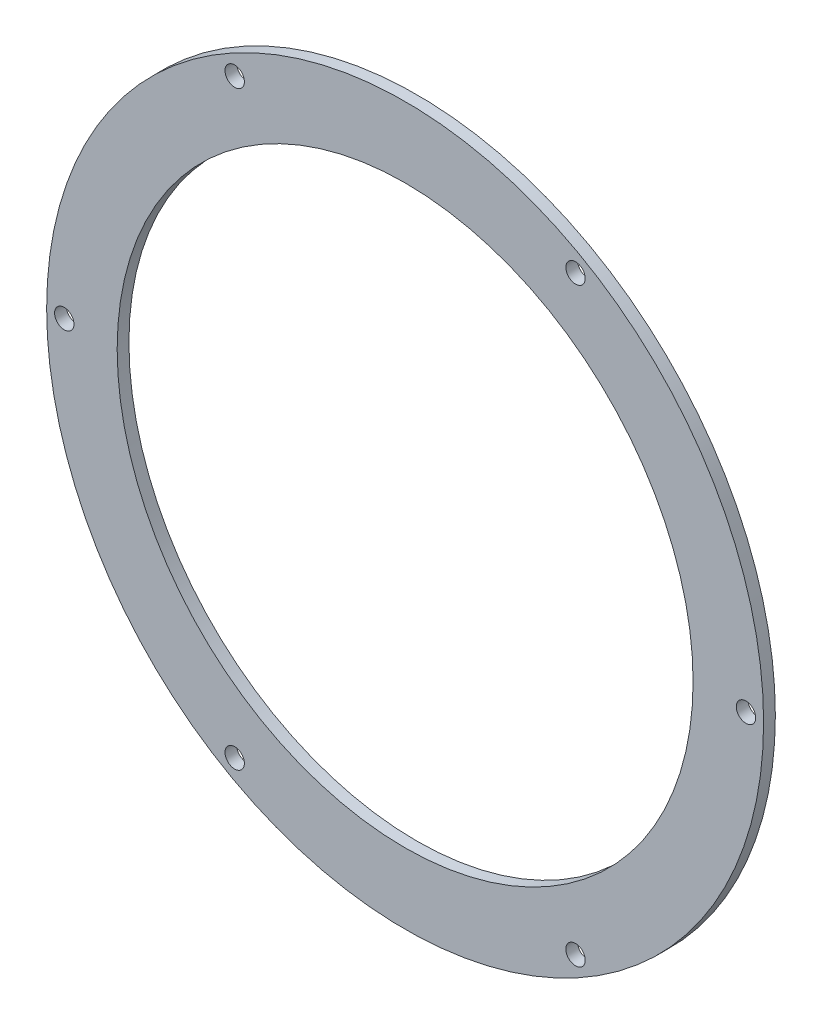
ISO-10303-21;
HEADER;
FILE_DESCRIPTION(('STEP AP214'),'2;1');
FILE_NAME('part.step','',(''),(''),'','','');
FILE_SCHEMA(('AUTOMOTIVE_DESIGN { 1 0 10303 214 1 1 1 1 }'));
ENDSEC;
DATA;
#1=APPLICATION_CONTEXT('core data for automotive mechanical design processes');
#2=APPLICATION_PROTOCOL_DEFINITION('international standard','automotive_design',2000,#1);
#3=PRODUCT_CONTEXT('',#1,'mechanical');
#4=PRODUCT('Part','Part','',(#3));
#5=PRODUCT_RELATED_PRODUCT_CATEGORY('part','',(#4));
#6=PRODUCT_DEFINITION_FORMATION('','',#4);
#7=PRODUCT_DEFINITION_CONTEXT('part definition',#1,'design');
#8=PRODUCT_DEFINITION('design','',#6,#7);
#9=PRODUCT_DEFINITION_SHAPE('','',#8);
#10=(LENGTH_UNIT() NAMED_UNIT(*) SI_UNIT(.MILLI.,.METRE.));
#11=(NAMED_UNIT(*) PLANE_ANGLE_UNIT() SI_UNIT($,.RADIAN.));
#12=(NAMED_UNIT(*) SI_UNIT($,.STERADIAN.) SOLID_ANGLE_UNIT());
#13=UNCERTAINTY_MEASURE_WITH_UNIT(LENGTH_MEASURE(1.E-05),#10,'distance_accuracy_value','');
#14=(GEOMETRIC_REPRESENTATION_CONTEXT(3) GLOBAL_UNCERTAINTY_ASSIGNED_CONTEXT((#13)) GLOBAL_UNIT_ASSIGNED_CONTEXT((#10,
#11,#12)) REPRESENTATION_CONTEXT('',''));
#15=CARTESIAN_POINT('',(0.,0.,0.));
#16=DIRECTION('',(0.,0.,1.));
#17=DIRECTION('',(1.,0.,0.));
#18=AXIS2_PLACEMENT_3D('',#15,#16,#17);
#19=CARTESIAN_POINT('',(0.,0.,17.));
#20=DIRECTION('',(0.,0.,1.));
#21=DIRECTION('',(1.,0.,0.));
#22=AXIS2_PLACEMENT_3D('',#19,#20,#21);
#23=PLANE('',#22);
#24=CARTESIAN_POINT('',(58.,0.,17.));
#25=DIRECTION('',(0.,0.,1.));
#26=DIRECTION('',(1.,0.,0.));
#27=AXIS2_PLACEMENT_3D('',#24,#25,#26);
#28=CIRCLE('',#27,1.65);
#29=CARTESIAN_POINT('',(59.65,0.,17.));
#30=VERTEX_POINT('',#29);
#31=EDGE_CURVE('E95',#30,#30,#28,.T.);
#32=ORIENTED_EDGE('',*,*,#31,.F.);
#33=EDGE_LOOP('',(#32));
#34=FACE_BOUND('',#33,.T.);
#35=CARTESIAN_POINT('',(29.,-50.2294734194974,17.));
#36=DIRECTION('',(0.,0.,1.));
#37=DIRECTION('',(1.,0.,0.));
#38=AXIS2_PLACEMENT_3D('',#35,#36,#37);
#39=CIRCLE('',#38,1.65);
#40=CARTESIAN_POINT('',(30.65,-50.2294734194974,17.));
#41=VERTEX_POINT('',#40);
#42=EDGE_CURVE('E79',#41,#41,#39,.T.);
#43=ORIENTED_EDGE('',*,*,#42,.F.);
#44=EDGE_LOOP('',(#43));
#45=FACE_BOUND('',#44,.T.);
#46=CARTESIAN_POINT('',(-29.,-50.2294734194974,17.));
#47=DIRECTION('',(0.,0.,1.));
#48=DIRECTION('',(1.,0.,0.));
#49=AXIS2_PLACEMENT_3D('',#46,#47,#48);
#50=CIRCLE('',#49,1.65);
#51=CARTESIAN_POINT('',(-27.35,-50.2294734194974,17.));
#52=VERTEX_POINT('',#51);
#53=EDGE_CURVE('E75',#52,#52,#50,.T.);
#54=ORIENTED_EDGE('',*,*,#53,.F.);
#55=EDGE_LOOP('',(#54));
#56=FACE_BOUND('',#55,.T.);
#57=CARTESIAN_POINT('',(-58.,0.,17.));
#58=DIRECTION('',(0.,0.,1.));
#59=DIRECTION('',(1.,0.,0.));
#60=AXIS2_PLACEMENT_3D('',#57,#58,#59);
#61=CIRCLE('',#60,1.65);
#62=CARTESIAN_POINT('',(-56.35,0.,17.));
#63=VERTEX_POINT('',#62);
#64=EDGE_CURVE('E71',#63,#63,#61,.T.);
#65=ORIENTED_EDGE('',*,*,#64,.F.);
#66=EDGE_LOOP('',(#65));
#67=FACE_BOUND('',#66,.T.);
#68=CARTESIAN_POINT('',(-29.,50.2294734194974,17.));
#69=DIRECTION('',(0.,0.,1.));
#70=DIRECTION('',(1.,0.,0.));
#71=AXIS2_PLACEMENT_3D('',#68,#69,#70);
#72=CIRCLE('',#71,1.65);
#73=CARTESIAN_POINT('',(-27.35,50.2294734194974,17.));
#74=VERTEX_POINT('',#73);
#75=EDGE_CURVE('E66',#74,#74,#72,.T.);
#76=ORIENTED_EDGE('',*,*,#75,.F.);
#77=EDGE_LOOP('',(#76));
#78=FACE_BOUND('',#77,.T.);
#79=CARTESIAN_POINT('',(29.,50.2294734194974,17.));
#80=DIRECTION('',(0.,0.,1.));
#81=DIRECTION('',(1.,0.,0.));
#82=AXIS2_PLACEMENT_3D('',#79,#80,#81);
#83=CIRCLE('',#82,1.65);
#84=CARTESIAN_POINT('',(30.65,50.2294734194974,17.));
#85=VERTEX_POINT('',#84);
#86=EDGE_CURVE('E61',#85,#85,#83,.T.);
#87=ORIENTED_EDGE('',*,*,#86,.F.);
#88=EDGE_LOOP('',(#87));
#89=FACE_BOUND('',#88,.T.);
#90=CARTESIAN_POINT('',(0.,0.,17.));
#91=DIRECTION('',(0.,0.,1.));
#92=DIRECTION('',(1.,0.,0.));
#93=AXIS2_PLACEMENT_3D('',#90,#91,#92);
#94=CIRCLE('',#93,61.);
#95=CARTESIAN_POINT('',(61.,0.,17.));
#96=VERTEX_POINT('',#95);
#97=EDGE_CURVE('E10',#96,#96,#94,.T.);
#98=ORIENTED_EDGE('',*,*,#97,.T.);
#99=EDGE_LOOP('',(#98));
#100=FACE_BOUND('',#99,.T.);
#101=CARTESIAN_POINT('',(0.,0.,17.));
#102=DIRECTION('',(0.,0.,1.));
#103=DIRECTION('',(1.,0.,0.));
#104=AXIS2_PLACEMENT_3D('',#101,#102,#103);
#105=CIRCLE('',#104,49.);
#106=CARTESIAN_POINT('',(49.,0.,17.));
#107=VERTEX_POINT('',#106);
#108=EDGE_CURVE('E52',#107,#107,#105,.T.);
#109=ORIENTED_EDGE('',*,*,#108,.F.);
#110=EDGE_LOOP('',(#109));
#111=FACE_BOUND('',#110,.T.);
#112=ADVANCED_FACE('F36',(#34,#45,#56,#67,#78,#89,#100,#111),#23,.T.);
#113=CARTESIAN_POINT('',(0.,0.,15.));
#114=DIRECTION('',(0.,0.,1.));
#115=DIRECTION('',(1.,0.,0.));
#116=AXIS2_PLACEMENT_3D('',#113,#114,#115);
#117=PLANE('',#116);
#118=CARTESIAN_POINT('',(58.,0.,15.));
#119=DIRECTION('',(0.,0.,1.));
#120=DIRECTION('',(1.,0.,0.));
#121=AXIS2_PLACEMENT_3D('',#118,#119,#120);
#122=CIRCLE('',#121,1.65);
#123=CARTESIAN_POINT('',(59.65,0.,15.));
#124=VERTEX_POINT('',#123);
#125=EDGE_CURVE('E40',#124,#124,#122,.T.);
#126=ORIENTED_EDGE('',*,*,#125,.T.);
#127=EDGE_LOOP('',(#126));
#128=FACE_BOUND('',#127,.T.);
#129=CARTESIAN_POINT('',(29.,-50.2294734194974,15.));
#130=DIRECTION('',(0.,0.,1.));
#131=DIRECTION('',(1.,0.,0.));
#132=AXIS2_PLACEMENT_3D('',#129,#130,#131);
#133=CIRCLE('',#132,1.65);
#134=CARTESIAN_POINT('',(30.65,-50.2294734194974,15.));
#135=VERTEX_POINT('',#134);
#136=EDGE_CURVE('E76',#135,#135,#133,.T.);
#137=ORIENTED_EDGE('',*,*,#136,.T.);
#138=EDGE_LOOP('',(#137));
#139=FACE_BOUND('',#138,.T.);
#140=CARTESIAN_POINT('',(-29.,-50.2294734194974,15.));
#141=DIRECTION('',(0.,0.,1.));
#142=DIRECTION('',(1.,0.,0.));
#143=AXIS2_PLACEMENT_3D('',#140,#141,#142);
#144=CIRCLE('',#143,1.65);
#145=CARTESIAN_POINT('',(-27.35,-50.2294734194974,15.));
#146=VERTEX_POINT('',#145);
#147=EDGE_CURVE('E72',#146,#146,#144,.T.);
#148=ORIENTED_EDGE('',*,*,#147,.T.);
#149=EDGE_LOOP('',(#148));
#150=FACE_BOUND('',#149,.T.);
#151=CARTESIAN_POINT('',(-58.,0.,15.));
#152=DIRECTION('',(0.,0.,1.));
#153=DIRECTION('',(1.,0.,0.));
#154=AXIS2_PLACEMENT_3D('',#151,#152,#153);
#155=CIRCLE('',#154,1.65);
#156=CARTESIAN_POINT('',(-56.35,0.,15.));
#157=VERTEX_POINT('',#156);
#158=EDGE_CURVE('E67',#157,#157,#155,.T.);
#159=ORIENTED_EDGE('',*,*,#158,.T.);
#160=EDGE_LOOP('',(#159));
#161=FACE_BOUND('',#160,.T.);
#162=CARTESIAN_POINT('',(-29.,50.2294734194974,15.));
#163=DIRECTION('',(0.,0.,1.));
#164=DIRECTION('',(1.,0.,0.));
#165=AXIS2_PLACEMENT_3D('',#162,#163,#164);
#166=CIRCLE('',#165,1.65);
#167=CARTESIAN_POINT('',(-27.35,50.2294734194974,15.));
#168=VERTEX_POINT('',#167);
#169=EDGE_CURVE('E62',#168,#168,#166,.T.);
#170=ORIENTED_EDGE('',*,*,#169,.T.);
#171=EDGE_LOOP('',(#170));
#172=FACE_BOUND('',#171,.T.);
#173=CARTESIAN_POINT('',(29.,50.2294734194974,15.));
#174=DIRECTION('',(0.,0.,1.));
#175=DIRECTION('',(1.,0.,0.));
#176=AXIS2_PLACEMENT_3D('',#173,#174,#175);
#177=CIRCLE('',#176,1.65);
#178=CARTESIAN_POINT('',(30.65,50.2294734194974,15.));
#179=VERTEX_POINT('',#178);
#180=EDGE_CURVE('E58',#179,#179,#177,.T.);
#181=ORIENTED_EDGE('',*,*,#180,.T.);
#182=EDGE_LOOP('',(#181));
#183=FACE_BOUND('',#182,.T.);
#184=CARTESIAN_POINT('',(0.,0.,15.));
#185=DIRECTION('',(0.,0.,1.));
#186=DIRECTION('',(1.,0.,0.));
#187=AXIS2_PLACEMENT_3D('',#184,#185,#186);
#188=CIRCLE('',#187,61.);
#189=CARTESIAN_POINT('',(61.,0.,15.));
#190=VERTEX_POINT('',#189);
#191=EDGE_CURVE('E45',#190,#190,#188,.T.);
#192=ORIENTED_EDGE('',*,*,#191,.F.);
#193=EDGE_LOOP('',(#192));
#194=FACE_BOUND('',#193,.T.);
#195=CARTESIAN_POINT('',(0.,0.,15.));
#196=DIRECTION('',(0.,0.,1.));
#197=DIRECTION('',(1.,0.,0.));
#198=AXIS2_PLACEMENT_3D('',#195,#196,#197);
#199=CIRCLE('',#198,49.);
#200=CARTESIAN_POINT('',(49.,0.,15.));
#201=VERTEX_POINT('',#200);
#202=EDGE_CURVE('E55',#201,#201,#199,.T.);
#203=ORIENTED_EDGE('',*,*,#202,.T.);
#204=EDGE_LOOP('',(#203));
#205=FACE_BOUND('',#204,.T.);
#206=ADVANCED_FACE('F105',(#128,#139,#150,#161,#172,#183,#194,#205),#117,.F.);
#207=CARTESIAN_POINT('',(0.,0.,17.));
#208=DIRECTION('',(0.,0.,-1.));
#209=DIRECTION('',(-1.,0.,0.));
#210=AXIS2_PLACEMENT_3D('',#207,#208,#209);
#211=CYLINDRICAL_SURFACE('',#210,61.);
#212=ORIENTED_EDGE('',*,*,#97,.F.);
#213=EDGE_LOOP('',(#212));
#214=FACE_BOUND('',#213,.T.);
#215=ORIENTED_EDGE('',*,*,#191,.T.);
#216=EDGE_LOOP('',(#215));
#217=FACE_BOUND('',#216,.T.);
#218=ADVANCED_FACE('F38',(#214,#217),#211,.T.);
#219=CARTESIAN_POINT('',(0.,0.,17.));
#220=DIRECTION('',(0.,0.,-1.));
#221=DIRECTION('',(-1.,0.,0.));
#222=AXIS2_PLACEMENT_3D('',#219,#220,#221);
#223=CYLINDRICAL_SURFACE('',#222,49.);
#224=ORIENTED_EDGE('',*,*,#108,.T.);
#225=EDGE_LOOP('',(#224));
#226=FACE_BOUND('',#225,.T.);
#227=ORIENTED_EDGE('',*,*,#202,.F.);
#228=EDGE_LOOP('',(#227));
#229=FACE_BOUND('',#228,.T.);
#230=ADVANCED_FACE('F107',(#226,#229),#223,.F.);
#231=CARTESIAN_POINT('',(29.,50.2294734194974,-100.));
#232=DIRECTION('',(0.,0.,1.));
#233=DIRECTION('',(1.,0.,0.));
#234=AXIS2_PLACEMENT_3D('',#231,#232,#233);
#235=CYLINDRICAL_SURFACE('',#234,1.65);
#236=ORIENTED_EDGE('',*,*,#86,.T.);
#237=EDGE_LOOP('',(#236));
#238=FACE_BOUND('',#237,.T.);
#239=ORIENTED_EDGE('',*,*,#180,.F.);
#240=EDGE_LOOP('',(#239));
#241=FACE_BOUND('',#240,.T.);
#242=ADVANCED_FACE('F109',(#238,#241),#235,.F.);
#243=CARTESIAN_POINT('',(-29.,50.2294734194974,-100.));
#244=DIRECTION('',(0.,0.,1.));
#245=DIRECTION('',(1.,0.,0.));
#246=AXIS2_PLACEMENT_3D('',#243,#244,#245);
#247=CYLINDRICAL_SURFACE('',#246,1.65);
#248=ORIENTED_EDGE('',*,*,#75,.T.);
#249=EDGE_LOOP('',(#248));
#250=FACE_BOUND('',#249,.T.);
#251=ORIENTED_EDGE('',*,*,#169,.F.);
#252=EDGE_LOOP('',(#251));
#253=FACE_BOUND('',#252,.T.);
#254=ADVANCED_FACE('F115',(#250,#253),#247,.F.);
#255=CARTESIAN_POINT('',(-58.,0.,-100.));
#256=DIRECTION('',(0.,0.,1.));
#257=DIRECTION('',(1.,0.,0.));
#258=AXIS2_PLACEMENT_3D('',#255,#256,#257);
#259=CYLINDRICAL_SURFACE('',#258,1.65);
#260=ORIENTED_EDGE('',*,*,#64,.T.);
#261=EDGE_LOOP('',(#260));
#262=FACE_BOUND('',#261,.T.);
#263=ORIENTED_EDGE('',*,*,#158,.F.);
#264=EDGE_LOOP('',(#263));
#265=FACE_BOUND('',#264,.T.);
#266=ADVANCED_FACE('F146',(#262,#265),#259,.F.);
#267=CARTESIAN_POINT('',(-29.,-50.2294734194974,-100.));
#268=DIRECTION('',(0.,0.,1.));
#269=DIRECTION('',(1.,0.,0.));
#270=AXIS2_PLACEMENT_3D('',#267,#268,#269);
#271=CYLINDRICAL_SURFACE('',#270,1.65);
#272=ORIENTED_EDGE('',*,*,#53,.T.);
#273=EDGE_LOOP('',(#272));
#274=FACE_BOUND('',#273,.T.);
#275=ORIENTED_EDGE('',*,*,#147,.F.);
#276=EDGE_LOOP('',(#275));
#277=FACE_BOUND('',#276,.T.);
#278=ADVANCED_FACE('F159',(#274,#277),#271,.F.);
#279=CARTESIAN_POINT('',(29.,-50.2294734194974,-100.));
#280=DIRECTION('',(0.,0.,1.));
#281=DIRECTION('',(1.,0.,0.));
#282=AXIS2_PLACEMENT_3D('',#279,#280,#281);
#283=CYLINDRICAL_SURFACE('',#282,1.65);
#284=ORIENTED_EDGE('',*,*,#42,.T.);
#285=EDGE_LOOP('',(#284));
#286=FACE_BOUND('',#285,.T.);
#287=ORIENTED_EDGE('',*,*,#136,.F.);
#288=EDGE_LOOP('',(#287));
#289=FACE_BOUND('',#288,.T.);
#290=ADVANCED_FACE('F164',(#286,#289),#283,.F.);
#291=CARTESIAN_POINT('',(58.,0.,-100.));
#292=DIRECTION('',(0.,0.,1.));
#293=DIRECTION('',(1.,0.,0.));
#294=AXIS2_PLACEMENT_3D('',#291,#292,#293);
#295=CYLINDRICAL_SURFACE('',#294,1.65);
#296=ORIENTED_EDGE('',*,*,#31,.T.);
#297=EDGE_LOOP('',(#296));
#298=FACE_BOUND('',#297,.T.);
#299=ORIENTED_EDGE('',*,*,#125,.F.);
#300=EDGE_LOOP('',(#299));
#301=FACE_BOUND('',#300,.T.);
#302=ADVANCED_FACE('F168',(#298,#301),#295,.F.);
#303=CLOSED_SHELL('',(#112,#206,#218,#230,#242,#254,#266,#278,#290,#302));
#304=MANIFOLD_SOLID_BREP('B2',#303);
#305=ADVANCED_BREP_SHAPE_REPRESENTATION('',(#18,#304),#14);
#306=SHAPE_DEFINITION_REPRESENTATION(#9,#305);
ENDSEC;
END-ISO-10303-21;
